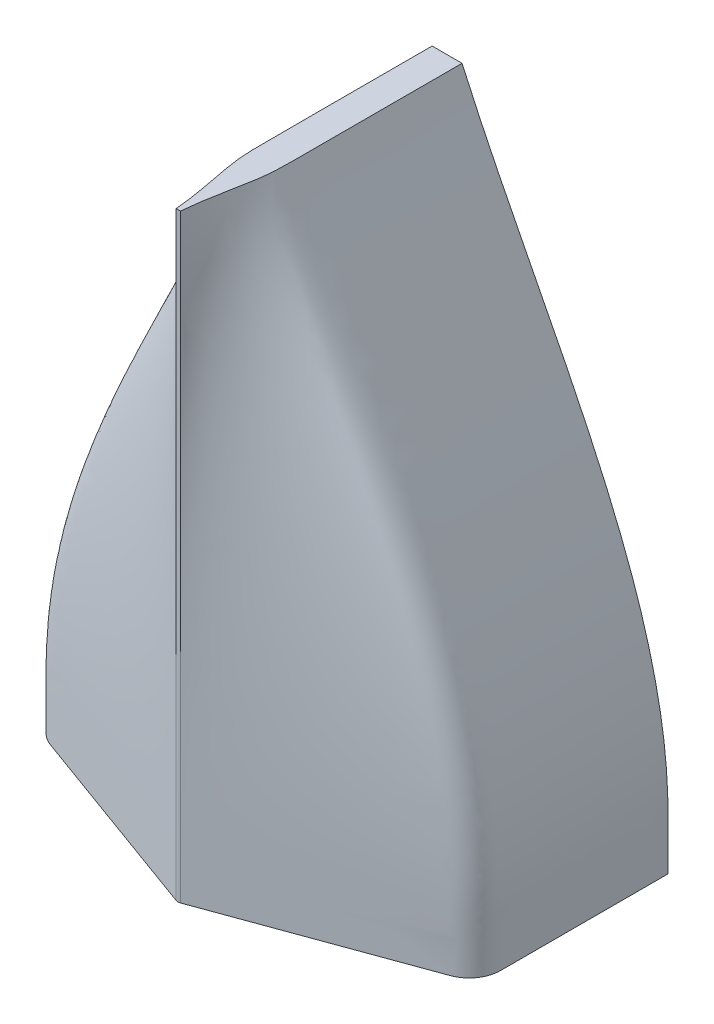
ISO-10303-21;
HEADER;
FILE_DESCRIPTION(('STEP AP214'),'2;1');
FILE_NAME('part.step','',(''),(''),'','','');
FILE_SCHEMA(('AUTOMOTIVE_DESIGN { 1 0 10303 214 1 1 1 1 }'));
ENDSEC;
DATA;
#1=APPLICATION_CONTEXT('core data for automotive mechanical design processes');
#2=APPLICATION_PROTOCOL_DEFINITION('international standard','automotive_design',2000,#1);
#3=PRODUCT_CONTEXT('',#1,'mechanical');
#4=PRODUCT('Part','Part','',(#3));
#5=PRODUCT_RELATED_PRODUCT_CATEGORY('part','',(#4));
#6=PRODUCT_DEFINITION_FORMATION('','',#4);
#7=PRODUCT_DEFINITION_CONTEXT('part definition',#1,'design');
#8=PRODUCT_DEFINITION('design','',#6,#7);
#9=PRODUCT_DEFINITION_SHAPE('','',#8);
#10=(LENGTH_UNIT() NAMED_UNIT(*) SI_UNIT(.MILLI.,.METRE.));
#11=(NAMED_UNIT(*) PLANE_ANGLE_UNIT() SI_UNIT($,.RADIAN.));
#12=(NAMED_UNIT(*) SI_UNIT($,.STERADIAN.) SOLID_ANGLE_UNIT());
#13=UNCERTAINTY_MEASURE_WITH_UNIT(LENGTH_MEASURE(1.E-05),#10,'distance_accuracy_value','');
#14=(GEOMETRIC_REPRESENTATION_CONTEXT(3) GLOBAL_UNCERTAINTY_ASSIGNED_CONTEXT((#13)) GLOBAL_UNIT_ASSIGNED_CONTEXT((#10,
#11,#12)) REPRESENTATION_CONTEXT('',''));
#15=CARTESIAN_POINT('',(0.,0.,0.));
#16=DIRECTION('',(0.,0.,1.));
#17=DIRECTION('',(1.,0.,0.));
#18=AXIS2_PLACEMENT_3D('',#15,#16,#17);
#19=CARTESIAN_POINT('',(69.3213828425096,0.,-0.817696380816725));
#20=DIRECTION('',(0.,-1.,0.));
#21=DIRECTION('',(0.,0.,-1.));
#22=AXIS2_PLACEMENT_3D('',#19,#20,#21);
#23=PLANE('',#22);
#24=DIRECTION('',(0.,0.,1.));
#25=VECTOR('',#24,1.);
#26=CARTESIAN_POINT('',(-60.6786171574904,0.,-0.81769638081678));
#27=LINE('',#26,#25);
#28=CARTESIAN_POINT('',(-60.6786171574904,0.,-53.8156209987196));
#29=VERTEX_POINT('',#28);
#30=CARTESIAN_POINT('',(-60.6786171574904,0.,-0.817696380816779));
#31=VERTEX_POINT('',#30);
#32=EDGE_CURVE('E348',#29,#31,#27,.T.);
#33=ORIENTED_EDGE('',*,*,#32,.F.);
#34=DIRECTION('',(-1.,0.,0.));
#35=VECTOR('',#34,1.);
#36=CARTESIAN_POINT('',(-60.6786171574904,0.,-53.8156209987196));
#37=LINE('',#36,#35);
#38=CARTESIAN_POINT('',(79.3213828425096,0.,-53.8156209987196));
#39=VERTEX_POINT('',#38);
#40=EDGE_CURVE('E418',#39,#29,#37,.T.);
#41=ORIENTED_EDGE('',*,*,#40,.F.);
#42=DIRECTION('',(0.,0.,-1.));
#43=VECTOR('',#42,1.);
#44=CARTESIAN_POINT('',(79.3213828425096,0.,-53.8156209987196));
#45=LINE('',#44,#43);
#46=CARTESIAN_POINT('',(79.3213828425096,0.,-0.817696380350896));
#47=VERTEX_POINT('',#46);
#48=EDGE_CURVE('E462',#47,#39,#45,.T.);
#49=ORIENTED_EDGE('',*,*,#48,.F.);
#50=CARTESIAN_POINT('',(69.3213828425096,0.,-0.817696380816725));
#51=DIRECTION('',(0.,1.,0.));
#52=DIRECTION('',(0.,0.,-1.));
#53=AXIS2_PLACEMENT_3D('',#50,#51,#52);
#54=CIRCLE('',#53,10.);
#55=CARTESIAN_POINT('',(72.7415842757666,0.,8.57922982704226));
#56=VERTEX_POINT('',#55);
#57=EDGE_CURVE('E469',#56,#47,#54,.T.);
#58=ORIENTED_EDGE('',*,*,#57,.F.);
#59=DIRECTION('',(0.939692620785911,0.,-0.342020143325663));
#60=VECTOR('',#59,1.);
#61=CARTESIAN_POINT('',(72.7415842757662,0.,8.5792298270424));
#62=LINE('',#61,#60);
#63=CARTESIAN_POINT('',(10.005423129161,0.,31.4133250965341));
#64=VERTEX_POINT('',#63);
#65=EDGE_CURVE('E480',#64,#56,#62,.T.);
#66=ORIENTED_EDGE('',*,*,#65,.F.);
#67=CARTESIAN_POINT('',(9.32138284250964,0.,29.5339398549623));
#68=DIRECTION('',(0.,1.,0.));
#69=DIRECTION('',(0.,0.,-1.));
#70=AXIS2_PLACEMENT_3D('',#67,#68,#69);
#71=CIRCLE('',#70,2.);
#72=CARTESIAN_POINT('',(8.6373425558583,0.,31.4133250965341));
#73=VERTEX_POINT('',#72);
#74=EDGE_CURVE('E343',#73,#64,#71,.T.);
#75=ORIENTED_EDGE('',*,*,#74,.F.);
#76=DIRECTION('',(0.939692620785911,0.,0.342020143325663));
#77=VECTOR('',#76,1.);
#78=CARTESIAN_POINT('',(8.6373425558583,0.,31.4133250965341));
#79=LINE('',#78,#77);
#80=CARTESIAN_POINT('',(-54.098818590747,0.,8.57922982704239));
#81=VERTEX_POINT('',#80);
#82=EDGE_CURVE('E509',#81,#73,#79,.T.);
#83=ORIENTED_EDGE('',*,*,#82,.F.);
#84=CARTESIAN_POINT('',(-50.6786171574904,0.,-0.817696380816728));
#85=DIRECTION('',(0.,1.,0.));
#86=DIRECTION('',(0.,0.,-1.));
#87=AXIS2_PLACEMENT_3D('',#84,#85,#86);
#88=CIRCLE('',#87,10.);
#89=EDGE_CURVE('E284',#31,#81,#88,.T.);
#90=ORIENTED_EDGE('',*,*,#89,.F.);
#91=EDGE_LOOP('',(#33,#41,#49,#58,#66,#75,#83,#90));
#92=FACE_BOUND('',#91,.T.);
#93=ADVANCED_FACE('F274',(#92),#23,.T.);
#94=CARTESIAN_POINT('',(8.82138284250962,200.,-53.8156209987196));
#95=DIRECTION('',(0.,0.,-1.));
#96=DIRECTION('',(1.,0.,0.));
#97=AXIS2_PLACEMENT_3D('',#94,#95,#96);
#98=PLANE('',#97);
#99=DIRECTION('',(-1.,0.,0.));
#100=VECTOR('',#99,1.);
#101=CARTESIAN_POINT('',(8.82138284250962,190.,-53.8156209987196));
#102=LINE('',#101,#100);
#103=CARTESIAN_POINT('',(14.0692876207852,190.,-53.8156209987196));
#104=VERTEX_POINT('',#103);
#105=CARTESIAN_POINT('',(4.57347806423401,190.,-53.8156209987196));
#106=VERTEX_POINT('',#105);
#107=EDGE_CURVE('E339',#104,#106,#102,.T.);
#108=ORIENTED_EDGE('',*,*,#107,.F.);
#109=CARTESIAN_POINT('',(9.82138284250962,200.,-53.8156209987196));
#110=CARTESIAN_POINT('',(34.0634562478761,140.393372464945,-53.8156209987196));
#111=CARTESIAN_POINT('',(80.362552085754,79.4719654991847,-53.8156209987195));
#112=CARTESIAN_POINT('',(79.2869193069982,9.99620187961251,-53.8156209987196));
#113=CARTESIAN_POINT('',(79.3213828425096,3.33333333333333,-53.8156209987196));
#114=CARTESIAN_POINT('',(79.3213828425096,0.,-53.8156209987196));
#115=B_SPLINE_CURVE_WITH_KNOTS('',3,(#109,#110,#111,#112,#113,#114),.UNSPECIFIED.,.F.,.F.,(4,1,
1,4),(0.,0.903879271275143,0.951939635637572,1.),.UNSPECIFIED.);
#116=EDGE_CURVE('E278',#104,#39,#115,.T.);
#117=ORIENTED_EDGE('',*,*,#116,.T.);
#118=ORIENTED_EDGE('',*,*,#40,.T.);
#119=CARTESIAN_POINT('',(8.82138284250962,200.,-53.8156209987196));
#120=CARTESIAN_POINT('',(-15.4206905628568,140.393372464945,-53.8156209987196));
#121=CARTESIAN_POINT('',(-61.7197864007349,79.4719654991847,-53.8156209987195));
#122=CARTESIAN_POINT('',(-60.6441536219789,9.99620187961251,-53.8156209987196));
#123=CARTESIAN_POINT('',(-60.6786171574904,3.33333333333333,-53.8156209987196));
#124=CARTESIAN_POINT('',(-60.6786171574904,0.,-53.8156209987196));
#125=B_SPLINE_CURVE_WITH_KNOTS('',3,(#119,#120,#121,#122,#123,#124),.UNSPECIFIED.,.F.,.F.,(4,1,
1,4),(0.,0.903879271275143,0.951939635637572,1.),.UNSPECIFIED.);
#126=EDGE_CURVE('E350',#29,#106,#125,.F.);
#127=ORIENTED_EDGE('',*,*,#126,.T.);
#128=EDGE_LOOP('',(#108,#117,#118,#127));
#129=FACE_BOUND('',#128,.T.);
#130=ADVANCED_FACE('F424',(#129),#98,.T.);
#131=CARTESIAN_POINT('',(9.82138284250962,200.,-53.8156209987196));
#132=CARTESIAN_POINT('',(34.0634562478761,140.393372464945,-53.8156209987196));
#133=CARTESIAN_POINT('',(80.362552085754,79.4719654991847,-53.8156209987195));
#134=CARTESIAN_POINT('',(79.2869193069982,9.99620187961251,-53.8156209987196));
#135=CARTESIAN_POINT('',(79.3213828425096,3.33333333333333,-53.8156209987196));
#136=CARTESIAN_POINT('',(79.3213828425096,0.,-53.8156209987196));
#137=CARTESIAN_POINT('',(9.82138284250962,200.,-50.482676560163));
#138=CARTESIAN_POINT('',(34.0622581634669,140.393685940455,-49.9923464884705));
#139=CARTESIAN_POINT('',(80.3625796479676,79.4719582876069,-48.5188687278219));
#140=CARTESIAN_POINT('',(79.2869183946668,9.99620211832151,-48.5531009509234));
#141=CARTESIAN_POINT('',(79.3213828425096,3.33333333333333,-48.55200414218));
#142=CARTESIAN_POINT('',(79.3213828425096,0.,-48.55200414218));
#143=CARTESIAN_POINT('',(9.82138284250962,200.,-43.1777571417248));
#144=CARTESIAN_POINT('',(34.0598619946487,140.394312891473,-41.7067669266471));
#145=CARTESIAN_POINT('',(80.3626347723949,79.4719438644514,-39.135492713872));
#146=CARTESIAN_POINT('',(79.2869165700042,9.99620259573951,-39.1952292330497));
#147=CARTESIAN_POINT('',(79.3213828425097,3.33333333333334,-39.1933152604648));
#148=CARTESIAN_POINT('',(79.3213828425097,0.,-39.1933152604648));
#149=CARTESIAN_POINT('',(9.82138284250962,200.,-29.7836860581526));
#150=CARTESIAN_POINT('',(34.0760346688234,140.394527772832,-28.5976716330076));
#151=CARTESIAN_POINT('',(80.3622627162224,79.4719389210551,-26.3043908397963));
#152=CARTESIAN_POINT('',(79.2869288853613,9.99620275936987,-26.3576689426929));
#153=CARTESIAN_POINT('',(79.3213828425096,3.33333333333333,-26.3559618993344));
#154=CARTESIAN_POINT('',(79.3213828425096,0.,-26.3559618993344));
#155=CARTESIAN_POINT('',(9.82138284250962,200.,-14.5809241513471));
#156=CARTESIAN_POINT('',(34.0152555740289,140.391860248948,-14.3801097762544));
#157=CARTESIAN_POINT('',(80.3636609535897,79.4720002880693,-13.8708825002475));
#158=CARTESIAN_POINT('',(79.2868826025851,9.99620072807257,-13.882713002334));
#159=CARTESIAN_POINT('',(79.3213828425096,3.33333333333333,-13.8823339501734));
#160=CARTESIAN_POINT('',(79.3213828425096,0.,-13.8823339501734));
#161=CARTESIAN_POINT('',(9.82138284250962,200.,-5.12492127300493));
#162=CARTESIAN_POINT('',(34.1674479525071,140.396379322998,-5.0864307385206));
#163=CARTESIAN_POINT('',(80.3601597321366,79.4718963257082,-5.32498140443458));
#164=CARTESIAN_POINT('',(79.2869984958182,9.99620416930996,-5.31943933258615));
#165=CARTESIAN_POINT('',(79.3213828425096,3.33333333333334,-5.31961690191438));
#166=CARTESIAN_POINT('',(79.3213828425096,0.,-5.31961690191438));
#167=CARTESIAN_POINT('',(9.82138284250962,200.,0.074649629141914));
#168=CARTESIAN_POINT('',(34.0419118463138,140.392749521437,0.0666753794124148));
#169=CARTESIAN_POINT('',(80.363047719778,79.4719798301466,0.116096925115402));
#170=CARTESIAN_POINT('',(79.2869029011152,9.99620140524619,0.114948750759664));
#171=CARTESIAN_POINT('',(79.3213828425096,3.33333333333333,0.114985538544923));
#172=CARTESIAN_POINT('',(79.3213828425096,0.,0.114985538544923));
#173=CARTESIAN_POINT('',(9.82138284250965,200.,2.07032083784979));
#174=CARTESIAN_POINT('',(33.9833638796793,140.391051554823,2.05006110407094));
#175=CARTESIAN_POINT('',(80.097903700917,79.4720188922679,1.98179279714276));
#176=CARTESIAN_POINT('',(79.0265585761082,9.99620011225871,1.98337882441507));
#177=CARTESIAN_POINT('',(79.0608847341457,3.33333333333333,1.98332800771601));
#178=CARTESIAN_POINT('',(79.0608847341457,0.,1.98332800771601));
#179=CARTESIAN_POINT('',(9.8213828425096,200.,4.85022373715482));
#180=CARTESIAN_POINT('',(33.5616332885196,140.378909988786,4.77473540721883));
#181=CARTESIAN_POINT('',(78.8930108862218,79.4722982118494,4.63712570105081));
#182=CARTESIAN_POINT('',(77.8398603922902,9.99619086655693,4.64032268595842));
#183=CARTESIAN_POINT('',(77.8736035899347,3.33333333333333,4.64022025378541));
#184=CARTESIAN_POINT('',(77.8736035899347,0.,4.64022025378541));
#185=CARTESIAN_POINT('',(9.82138284250963,200.,6.6083811124841));
#186=CARTESIAN_POINT('',(32.9808354071925,140.362406798836,6.59941989288879));
#187=CARTESIAN_POINT('',(77.1855583077032,79.4726778716149,6.58635309607367));
#188=CARTESIAN_POINT('',(76.1585825521916,9.99617829951475,6.586656667336));
#189=CARTESIAN_POINT('',(76.1914871048591,3.33333333333333,6.58664694083901));
#190=CARTESIAN_POINT('',(76.1914871048591,0.,6.58664694083901));
#191=CARTESIAN_POINT('',(9.82138284250962,200.,7.79612244759282));
#192=CARTESIAN_POINT('',(32.3632216015056,140.345165817862,7.82101843325157));
#193=CARTESIAN_POINT('',(75.3563930488216,79.4730745044362,7.8599775526634));
#194=CARTESIAN_POINT('',(74.3575643755073,9.99616517065082,7.8590724441486));
#195=CARTESIAN_POINT('',(74.3895670888241,3.33333333333333,7.85910144404527));
#196=CARTESIAN_POINT('',(74.3895670888241,0.,7.85910144404527));
#197=CARTESIAN_POINT('',(9.82138284250962,200.,8.32702778065809));
#198=CARTESIAN_POINT('',(31.9824590240575,140.334687906767,8.33468912144861));
#199=CARTESIAN_POINT('',(74.2733360882162,79.4733155512447,8.3686286337514));
#200=CARTESIAN_POINT('',(73.2908233028298,9.99615719180847,8.36784014206994));
#201=CARTESIAN_POINT('',(73.3223032511341,3.33333333333333,8.36786540553494));
#202=CARTESIAN_POINT('',(73.3223032511341,0.,8.36786540553494));
#203=CARTESIAN_POINT('',(9.83896553445853,200.,10.7607351396051));
#204=CARTESIAN_POINT('',(30.1324001579765,140.283754978419,10.6944884214369));
#205=CARTESIAN_POINT('',(68.5829719999392,79.4744872752377,10.4009549976643));
#206=CARTESIAN_POINT('',(67.6896781961046,9.99611840680622,10.4077744434128));
#207=CARTESIAN_POINT('',(67.7182995465679,3.33333333333333,10.4075559467145));
#208=CARTESIAN_POINT('',(67.7182995465679,0.,10.4075559467145));
#209=CARTESIAN_POINT('',(9.86831104105107,200.,14.4016667283226));
#210=CARTESIAN_POINT('',(26.3414765776926,140.186607783641,14.3463667761305));
#211=CARTESIAN_POINT('',(57.7430657141222,79.4767221692966,14.2940881479467));
#212=CARTESIAN_POINT('',(57.0135357315403,9.9960444300236,14.2953026987945));
#213=CARTESIAN_POINT('',(57.0369100493911,3.33333333333333,14.2952637842904));
#214=CARTESIAN_POINT('',(57.0369100493911,0.,14.2952637842904));
#215=CARTESIAN_POINT('',(9.90802822621158,200.,19.3294247007361));
#216=CARTESIAN_POINT('',(20.5039224252382,140.075160229472,19.7040588375884));
#217=CARTESIAN_POINT('',(40.5357240313382,79.4792860464862,20.4826724956339));
#218=CARTESIAN_POINT('',(40.0703399447784,9.99595956363601,20.4645835382272));
#219=CARTESIAN_POINT('',(40.0852509639574,3.33333333333334,20.4651631128165));
#220=CARTESIAN_POINT('',(40.0852509639574,0.,20.4651631128165));
#221=CARTESIAN_POINT('',(9.95061349002079,200.,24.6130285713264));
#222=CARTESIAN_POINT('',(14.8307555466657,140.009734278117,25.3291132058318));
#223=CARTESIAN_POINT('',(24.1589897059,79.4807911858812,26.3614133052045));
#224=CARTESIAN_POINT('',(23.9422737150583,9.995909742317,26.3374306376319));
#225=CARTESIAN_POINT('',(23.949217348047,3.33333333333333,26.3381990481265));
#226=CARTESIAN_POINT('',(23.949217348047,0.,26.3381990481265));
#227=CARTESIAN_POINT('',(9.98135343470422,200.,28.4269697374265));
#228=CARTESIAN_POINT('',(11.6080674535859,140.003244759372,28.665664615595));
#229=CARTESIAN_POINT('',(14.5024906840442,79.4809404787859,29.826317645691));
#230=CARTESIAN_POINT('',(14.4352466818465,9.99590480060234,29.7993530490539));
#231=CARTESIAN_POINT('',(14.4374011960111,3.33333333333333,29.80021700128));
#232=CARTESIAN_POINT('',(14.4374011960111,0.,29.80021700128));
#233=CARTESIAN_POINT('',(10.005423129161,200.,31.4133250965341));
#234=CARTESIAN_POINT('',(10.005423129161,140.,31.4133250965341));
#235=CARTESIAN_POINT('',(10.0054231291609,79.4810151252383,31.4133250965341));
#236=CARTESIAN_POINT('',(10.005423129161,9.99590232974501,31.4133250965341));
#237=CARTESIAN_POINT('',(10.005423129161,3.33333333333333,31.4133250965341));
#238=CARTESIAN_POINT('',(10.005423129161,0.,31.4133250965341));
#239=B_SPLINE_SURFACE_WITH_KNOTS('',3,3,((#131,#132,#133,#134,#135,#136),(#137,#138,#139,#140,
#141,#142),(#143,#144,#145,#146,#147,#148),(#149,#150,#151,#152,#153,#154),(#155,#156,#157,#158,
#159,#160),(#161,#162,#163,#164,#165,#166),(#167,#168,#169,#170,#171,#172),(#173,#174,#175,#176,
#177,#178),(#179,#180,#181,#182,#183,#184),(#185,#186,#187,#188,#189,#190),(#191,#192,#193,#194,
#195,#196),(#197,#198,#199,#200,#201,#202),(#203,#204,#205,#206,#207,#208),(#209,#210,#211,#212,
#213,#214),(#215,#216,#217,#218,#219,#220),(#221,#222,#223,#224,#225,#226),(#227,#228,#229,#230,
#231,#232),(#233,#234,#235,#236,#237,#238)),.UNSPECIFIED.,.F.,.F.,.F.,(4,1,1,1,2,1,1,1,1,2,1,1,
1,4),(4,1,1,4),(0.,0.118865670859502,0.237731341719005,0.356597012578507,0.475462683438009,
0.500088587533455,0.5247144916289,0.549340395724345,0.561653347772068,0.573966299819791,
0.680474724864843,0.786983149909895,0.893491574954948,1.),(0.,0.903879271275143,
0.951939635637572,1.),.UNSPECIFIED.);
#240=CARTESIAN_POINT('',(10.005423129161,190.,31.4133250965341));
#241=CARTESIAN_POINT('',(10.0418568858361,190.,30.9975093731855));
#242=CARTESIAN_POINT('',(10.0803577473287,190.,30.581861922396));
#243=CARTESIAN_POINT('',(10.1624101381668,190.,29.7514600602642));
#244=CARTESIAN_POINT('',(10.2059569138712,190.,29.3367051773534));
#245=CARTESIAN_POINT('',(10.2990498903314,190.,28.5081540371158));
#246=CARTESIAN_POINT('',(10.3485919167432,190.,28.0943573149115));
#247=CARTESIAN_POINT('',(10.454386525077,190.,27.2677744209949));
#248=CARTESIAN_POINT('',(10.5106366399034,190.,26.8549879343908));
#249=CARTESIAN_POINT('',(10.5997750662539,190.,26.2365117106941));
#250=CARTESIAN_POINT('',(10.6302810059505,190.,26.0304748784739));
#251=CARTESIAN_POINT('',(10.6926660106328,190.,25.6186086285125));
#252=CARTESIAN_POINT('',(10.7245450798746,190.,25.4127792114161));
#253=CARTESIAN_POINT('',(10.7893856382574,190.,25.001014499915));
#254=CARTESIAN_POINT('',(10.8223484948582,190.,24.7950794218599));
#255=CARTESIAN_POINT('',(10.8890181515602,190.,24.3833300659253));
#256=CARTESIAN_POINT('',(10.9227249509189,190.,24.1775157879255));
#257=CARTESIAN_POINT('',(10.9908951328117,190.,23.7659579447442));
#258=CARTESIAN_POINT('',(11.0253587084389,190.,23.5602144115394));
#259=CARTESIAN_POINT('',(11.0949883415856,190.,23.1488464584885));
#260=CARTESIAN_POINT('',(11.1301543988279,190.,22.9432220385953));
#261=CARTESIAN_POINT('',(11.23668324563,190.,22.3263767137973));
#262=CARTESIAN_POINT('',(11.3090525444789,190.,21.915329330081));
#263=CARTESIAN_POINT('',(11.4561973379716,190.,21.093480668225));
#264=CARTESIAN_POINT('',(11.5309738724015,190.,20.6826795766735));
#265=CARTESIAN_POINT('',(11.6826695399804,190.,19.861257855825));
#266=CARTESIAN_POINT('',(11.759589741852,190.,19.4506374240942));
#267=CARTESIAN_POINT('',(11.9530415264911,190.,18.4289913001586));
#268=CARTESIAN_POINT('',(12.0705505299982,190.,17.8181515002773));
#269=CARTESIAN_POINT('',(12.2470104768426,190.,16.9018664622033));
#270=CARTESIAN_POINT('',(12.3058692291447,190.,16.5964026509014));
#271=CARTESIAN_POINT('',(12.423243488717,190.,15.9854095846826));
#272=CARTESIAN_POINT('',(12.481758996873,190.,15.6798803299366));
#273=CARTESIAN_POINT('',(12.5980203486717,190.,15.0688091437178));
#274=CARTESIAN_POINT('',(12.6557665074151,190.,14.7632672722764));
#275=CARTESIAN_POINT('',(12.7701922657155,190.,14.1519802463159));
#276=CARTESIAN_POINT('',(12.8268718552349,190.,13.8462350899117));
#277=CARTESIAN_POINT('',(12.9383889764017,190.,13.2347104391324));
#278=CARTESIAN_POINT('',(12.9932282223222,190.,12.9289312588277));
#279=CARTESIAN_POINT('',(13.1004783774922,190.,12.3169553675821));
#280=CARTESIAN_POINT('',(13.1528893587018,190.,12.0107586692911));
#281=CARTESIAN_POINT('',(13.2547661706731,190.,11.3982864674946));
#282=CARTESIAN_POINT('',(13.3042357729505,190.,11.0920115937273));
#283=CARTESIAN_POINT('',(13.3760746374261,190.,10.6322186565595));
#284=CARTESIAN_POINT('',(13.3996275493832,190.,10.4788848650313));
#285=CARTESIAN_POINT('',(13.4459234307475,190.,10.1720960892732));
#286=CARTESIAN_POINT('',(13.4686664062795,190.,10.0186411059686));
#287=CARTESIAN_POINT('',(13.5132989503724,190.,9.71181896182743));
#288=CARTESIAN_POINT('',(13.535189631262,190.,9.55845196279478));
#289=CARTESIAN_POINT('',(13.5781379140995,190.,9.25159819987269));
#290=CARTESIAN_POINT('',(13.5991954991156,190.,9.0981114336137));
#291=CARTESIAN_POINT('',(13.640493925663,190.,8.79104625264623));
#292=CARTESIAN_POINT('',(13.6607348620596,190.,8.63746785069804));
#293=CARTESIAN_POINT('',(13.6904405080566,190.,8.40701776982521));
#294=CARTESIAN_POINT('',(13.7002329643027,190.,8.33018840727341));
#295=CARTESIAN_POINT('',(13.7193618592399,190.,8.1764731294969));
#296=CARTESIAN_POINT('',(13.7286983014517,190.,8.09958721471347));
#297=CARTESIAN_POINT('',(13.7467624849188,190.,7.94579044409891));
#298=CARTESIAN_POINT('',(13.7554905896708,190.,7.8688796312331));
#299=CARTESIAN_POINT('',(13.7722142868635,190.,7.71497827782385));
#300=CARTESIAN_POINT('',(13.7802098777484,190.,7.63798773711144));
#301=CARTESIAN_POINT('',(13.8032327136745,190.,7.40691808974164));
#302=CARTESIAN_POINT('',(13.8172957979004,190.,7.25274288101525));
#303=CARTESIAN_POINT('',(13.8434719128316,190.,6.94421990440132));
#304=CARTESIAN_POINT('',(13.8555848146928,190.,6.7898721257903));
#305=CARTESIAN_POINT('',(13.8781987651561,190.,6.48105904470327));
#306=CARTESIAN_POINT('',(13.8886998136274,190.,6.32659374221772));
#307=CARTESIAN_POINT('',(13.9082942695531,190.,6.01747429565262));
#308=CARTESIAN_POINT('',(13.9173867629833,190.,5.86282009404456));
#309=CARTESIAN_POINT('',(13.9343525762866,190.,5.5534459173822));
#310=CARTESIAN_POINT('',(13.9422259001238,190.,5.39872594254342));
#311=CARTESIAN_POINT('',(13.9642647199902,190.,4.93449771492153));
#312=CARTESIAN_POINT('',(13.9768494815838,190.,4.62491433456912));
#313=CARTESIAN_POINT('',(13.9989257861922,190.,4.00520335012767));
#314=CARTESIAN_POINT('',(14.0084129277178,190.,3.69507559575264));
#315=CARTESIAN_POINT('',(14.024911687343,190.,3.07475653961541));
#316=CARTESIAN_POINT('',(14.031923319743,190.,2.76456523823067));
#317=CARTESIAN_POINT('',(14.0437073841942,190.,2.14379889118605));
#318=CARTESIAN_POINT('',(14.0484773394013,190.,1.83322379943474));
#319=CARTESIAN_POINT('',(14.0562445936621,190.,1.21205165864302));
#320=CARTESIAN_POINT('',(14.0592418880726,190.,0.901454609547225));
#321=CARTESIAN_POINT('',(14.0664553320369,190.,-0.0306648313405029));
#322=CARTESIAN_POINT('',(14.0688881805571,190.,-0.652199538705247));
#323=CARTESIAN_POINT('',(14.0718395932471,190.,-1.58443946598823));
#324=CARTESIAN_POINT('',(14.0727070363245,190.,-1.89514512117239));
#325=CARTESIAN_POINT('',(14.0741827140232,190.,-2.51655723355313));
#326=CARTESIAN_POINT('',(14.0747909487101,190.,-2.8272636907495));
#327=CARTESIAN_POINT('',(14.0762926683625,190.,-3.75509821787286));
#328=CARTESIAN_POINT('',(14.0768758966359,190.,-4.37222671456641));
#329=CARTESIAN_POINT('',(14.0774273804327,190.,-5.60603207395503));
#330=CARTESIAN_POINT('',(14.0773960859314,190.,-6.22270893647983));
#331=CARTESIAN_POINT('',(14.0769199865491,190.,-7.45573160599003));
#332=CARTESIAN_POINT('',(14.0764754035251,190.,-8.07207741308746));
#333=CARTESIAN_POINT('',(14.0753473390287,190.,-9.30455857022309));
#334=CARTESIAN_POINT('',(14.0746639390899,190.,-9.92069392034238));
#335=CARTESIAN_POINT('',(14.0732186511757,190.,-11.1528747326969));
#336=CARTESIAN_POINT('',(14.0724567746527,190.,-11.7689201949467));
#337=CARTESIAN_POINT('',(14.0709968676156,190.,-13.0010417905108));
#338=CARTESIAN_POINT('',(14.0702988402735,190.,-13.6171179238292));
#339=CARTESIAN_POINT('',(14.069121628284,190.,-14.8503311297203));
#340=CARTESIAN_POINT('',(14.0686428224952,190.,-15.4674682026696));
#341=CARTESIAN_POINT('',(14.067900147603,190.,-16.701863068804));
#342=CARTESIAN_POINT('',(14.0676363205192,190.,-17.3191208620134));
#343=CARTESIAN_POINT('',(14.0672739805429,190.,-18.5537263813975));
#344=CARTESIAN_POINT('',(14.0671754917299,190.,-19.1710741075788));
#345=CARTESIAN_POINT('',(14.0671086789996,190.,-20.4058287127268));
#346=CARTESIAN_POINT('',(14.0671403675543,190.,-21.0232355916939));
#347=CARTESIAN_POINT('',(14.0672970478129,190.,-22.2580777201884));
#348=CARTESIAN_POINT('',(14.0674220438062,190.,-22.8755129697152));
#349=CARTESIAN_POINT('',(14.0677292299569,190.,-24.1103810576941));
#350=CARTESIAN_POINT('',(14.0679114198923,190.,-24.7278138961463));
#351=CARTESIAN_POINT('',(14.0683525474883,190.,-26.1368748654329));
#352=CARTESIAN_POINT('',(14.0686186361942,190.,-26.928502993865));
#353=CARTESIAN_POINT('',(14.0690982570207,190.,-28.5117138168839));
#354=CARTESIAN_POINT('',(14.069311792158,190.,-29.3032965114696));
#355=CARTESIAN_POINT('',(14.0696298625467,190.,-30.8864255659257));
#356=CARTESIAN_POINT('',(14.069734402804,190.,-31.6779719257951));
#357=CARTESIAN_POINT('',(14.0698640617606,190.,-33.2610373988012));
#358=CARTESIAN_POINT('',(14.0698891831942,190.,-34.0525565119379));
#359=CARTESIAN_POINT('',(14.069877694172,190.,-35.6355765853839));
#360=CARTESIAN_POINT('',(14.0698410851318,190.,-36.4270775456934));
#361=CARTESIAN_POINT('',(14.0697311376956,190.,-38.010070405754));
#362=CARTESIAN_POINT('',(14.0696577997197,190.,-38.8015623055053));
#363=CARTESIAN_POINT('',(14.0695010710912,190.,-40.3831439289347));
#364=CARTESIAN_POINT('',(14.0694176984775,190.,-41.1732336526147));
#365=CARTESIAN_POINT('',(14.0692784481812,190.,-42.7534221842864));
#366=CARTESIAN_POINT('',(14.0692225708147,190.,-43.5435209922781));
#367=CARTESIAN_POINT('',(14.0691439896,190.,-45.1237367419549));
#368=CARTESIAN_POINT('',(14.0691212865133,190.,-45.9138536836401));
#369=CARTESIAN_POINT('',(14.0691018465433,190.,-47.4941147503719));
#370=CARTESIAN_POINT('',(14.0691051105534,190.,-48.2842588754185));
#371=CARTESIAN_POINT('',(14.0691320961118,190.,-49.8645833586836));
#372=CARTESIAN_POINT('',(14.0691558185982,190.,-50.6547637169022));
#373=CARTESIAN_POINT('',(14.0692150490851,190.,-52.2351697163902));
#374=CARTESIAN_POINT('',(14.0692505577608,190.,-53.0253953576596));
#375=CARTESIAN_POINT('',(14.0692876207852,190.,-53.8156209987196));
#376=B_SPLINE_CURVE_WITH_KNOTS('',3,(#240,#241,#242,#243,#244,#245,#246,#247,#248,#249,#250,
#251,#252,#253,#254,#255,#256,#257,#258,#259,#260,#261,#262,#263,#264,#265,#266,#267,#268,#269,
#270,#271,#272,#273,#274,#275,#276,#277,#278,#279,#280,#281,#282,#283,#284,#285,#286,#287,#288,
#289,#290,#291,#292,#293,#294,#295,#296,#297,#298,#299,#300,#301,#302,#303,#304,#305,#306,#307,
#308,#309,#310,#311,#312,#313,#314,#315,#316,#317,#318,#319,#320,#321,#322,#323,#324,#325,#326,
#327,#328,#329,#330,#331,#332,#333,#334,#335,#336,#337,#338,#339,#340,#341,#342,#343,#344,#345,
#346,#347,#348,#349,#350,#351,#352,#353,#354,#355,#356,#357,#358,#359,#360,#361,#362,#363,#364,
#365,#366,#367,#368,#369,#370,#371,#372,#373,#374,#375),.UNSPECIFIED.,.F.,.F.,(4,2,2,2,2,2,2,2,
2,2,2,2,2,2,2,2,2,2,2,2,2,2,2,2,2,2,2,2,2,2,2,2,2,2,2,2,2,2,2,2,2,2,2,2,2,2,2,2,2,2,2,2,2,2,2,2,
2,2,2,2,2,2,2,2,2,2,2,4),(0.,1.25224068896315,2.5033111175699,3.75351541549371,5.00326132412164,
5.62810597841746,6.25295256956061,6.87862033565439,7.50428747735084,8.13011615828289,
8.75594459233923,10.0080441864788,11.2606920697688,12.5139760433443,14.3800915613445,
15.313340233619,16.2465864963954,17.1794379925291,18.1122982634197,19.0442639930178,
19.9762020867421,20.9069182425519,21.3723129497434,21.8377041368295,22.3024660595186,
22.7672374231354,23.2319546405773,23.4643067362211,23.6966570376729,23.9288672922379,
24.1610780399783,24.6255053431513,25.0899633173695,25.5544213292854,26.0191794810487,
26.4839361215836,27.4134288929827,28.3442367145979,29.2750391590711,30.206867649397,
31.138698580521,33.0033084548763,33.9354296012754,34.8675505111518,36.7189364780867,
38.5689668450868,40.4180046721039,42.2664118410711,44.1145496464314,45.9627792132957,
47.8141909437812,49.6659644637548,51.5180076488119,53.3702282780544,55.2225340602665,
57.0748326550932,59.4497171750319,61.8244653400339,64.1991044337724,66.5736617716717,
68.948164653471,71.3226403627189,73.6929095468891,76.0632059760731,78.433556801534,
80.8039891763524,83.1745302519508,85.545207177962),.UNSPECIFIED.);
#377=CARTESIAN_POINT('',(10.005423129161,190.,31.4133250965341));
#378=VERTEX_POINT('',#377);
#379=EDGE_CURVE('E328',#378,#104,#376,.T.);
#380=DIRECTION('',(0.,-1.,0.));
#381=VECTOR('',#380,1.);
#382=CARTESIAN_POINT('',(10.005423129161,101.469587420133,31.4133250965341));
#383=LINE('',#382,#381);
#384=EDGE_CURVE('E336',#378,#64,#383,.T.);
#385=ORIENTED_EDGE('',*,*,#379,.F.);
#386=ORIENTED_EDGE('',*,*,#384,.T.);
#387=ORIENTED_EDGE('',*,*,#65,.T.);
#388=ORIENTED_EDGE('',*,*,#57,.T.);
#389=ORIENTED_EDGE('',*,*,#48,.T.);
#390=ORIENTED_EDGE('',*,*,#116,.F.);
#391=EDGE_LOOP('',(#385,#386,#387,#388,#389,#390));
#392=FACE_BOUND('',#391,.T.);
#393=ADVANCED_FACE('F335',(#392),#239,.T.);
#394=CARTESIAN_POINT('',(8.6373425558583,200.,31.4133250965341));
#395=CARTESIAN_POINT('',(8.6373425558583,140.,31.4133250965341));
#396=CARTESIAN_POINT('',(8.63734255585828,79.4810151252383,31.4133250965341));
#397=CARTESIAN_POINT('',(8.6373425558583,9.99590232974501,31.4133250965341));
#398=CARTESIAN_POINT('',(8.6373425558583,3.33333333333333,31.4133250965341));
#399=CARTESIAN_POINT('',(8.6373425558583,0.,31.4133250965341));
#400=CARTESIAN_POINT('',(8.66141225031505,200.,28.4269697374265));
#401=CARTESIAN_POINT('',(7.0346982314334,140.003244759372,28.665664615595));
#402=CARTESIAN_POINT('',(4.14027500097503,79.4809404787859,29.826317645691));
#403=CARTESIAN_POINT('',(4.20751900317274,9.99590480060234,29.7993530490539));
#404=CARTESIAN_POINT('',(4.2053644890082,3.33333333333333,29.80021700128));
#405=CARTESIAN_POINT('',(4.2053644890082,0.,29.80021700128));
#406=CARTESIAN_POINT('',(8.69215219499848,200.,24.6130285713264));
#407=CARTESIAN_POINT('',(3.81201013835354,140.009734278117,25.3291132058318));
#408=CARTESIAN_POINT('',(-5.51622402088083,79.4807911858813,26.3614133052046));
#409=CARTESIAN_POINT('',(-5.29950803003907,9.99590974231701,26.3374306376319));
#410=CARTESIAN_POINT('',(-5.30645166302775,3.33333333333333,26.3381990481266));
#411=CARTESIAN_POINT('',(-5.30645166302775,0.,26.3381990481266));
#412=CARTESIAN_POINT('',(8.73473745880767,200.,19.3294247007362));
#413=CARTESIAN_POINT('',(-1.86115674021887,140.075160229473,19.7040588375884));
#414=CARTESIAN_POINT('',(-21.8929583463189,79.4792860464861,20.4826724956338));
#415=CARTESIAN_POINT('',(-21.4275742597591,9.995959563636,20.4645835382271));
#416=CARTESIAN_POINT('',(-21.4424852789381,3.33333333333333,20.4651631128164));
#417=CARTESIAN_POINT('',(-21.4424852789381,0.,20.4651631128164));
#418=CARTESIAN_POINT('',(8.77445464396818,200.,14.4016667283226));
#419=CARTESIAN_POINT('',(-7.69871089267341,140.186607783641,14.3463667761305));
#420=CARTESIAN_POINT('',(-39.1003000291031,79.4767221692968,14.2940881479468));
#421=CARTESIAN_POINT('',(-38.3707700465211,9.99604443002362,14.2953026987946));
#422=CARTESIAN_POINT('',(-38.3941443643719,3.33333333333334,14.2952637842904));
#423=CARTESIAN_POINT('',(-38.3941443643719,0.,14.2952637842904));
#424=CARTESIAN_POINT('',(8.80380015056072,200.,10.760735139605));
#425=CARTESIAN_POINT('',(-11.4896344729573,140.283754978418,10.6944884214369));
#426=CARTESIAN_POINT('',(-49.94020631492,79.4744872752377,10.4009549976643));
#427=CARTESIAN_POINT('',(-49.0469125110854,9.99611840680622,10.4077744434128));
#428=CARTESIAN_POINT('',(-49.0755338615487,3.33333333333333,10.4075559467145));
#429=CARTESIAN_POINT('',(-49.0755338615487,0.,10.4075559467145));
#430=CARTESIAN_POINT('',(8.82138284250962,200.,8.32702778065808));
#431=CARTESIAN_POINT('',(-13.3396933390383,140.334687906767,8.33468912144861));
#432=CARTESIAN_POINT('',(-55.6305704031969,79.4733155512447,8.36862863375139));
#433=CARTESIAN_POINT('',(-54.6480576178105,9.99615719180847,8.36784014206993));
#434=CARTESIAN_POINT('',(-54.6795375661148,3.33333333333333,8.36786540553494));
#435=CARTESIAN_POINT('',(-54.6795375661148,0.,8.36786540553494));
#436=CARTESIAN_POINT('',(8.82138284250962,200.,7.79612244759282));
#437=CARTESIAN_POINT('',(-13.7204559164863,140.345165817863,7.82101843325157));
#438=CARTESIAN_POINT('',(-56.7136273638026,79.4730745044361,7.8599775526634));
#439=CARTESIAN_POINT('',(-55.7147986904881,9.99616517065081,7.8590724441486));
#440=CARTESIAN_POINT('',(-55.7468014038049,3.33333333333333,7.85910144404527));
#441=CARTESIAN_POINT('',(-55.7468014038049,0.,7.85910144404527));
#442=CARTESIAN_POINT('',(8.82138284250962,200.,6.60838111248409));
#443=CARTESIAN_POINT('',(-14.3380697221732,140.362406798836,6.59941989288879));
#444=CARTESIAN_POINT('',(-58.5427926226838,79.4726778716149,6.58635309607366));
#445=CARTESIAN_POINT('',(-57.5158168671722,9.99617829951476,6.58665666733599));
#446=CARTESIAN_POINT('',(-57.5487214198397,3.33333333333334,6.586646940839));
#447=CARTESIAN_POINT('',(-57.5487214198397,0.,6.586646940839));
#448=CARTESIAN_POINT('',(8.82138284250962,200.,4.85022373715481));
#449=CARTESIAN_POINT('',(-14.9188676035003,140.378909988786,4.77473540721883));
#450=CARTESIAN_POINT('',(-60.2502452012027,79.4722982118493,4.63712570105081));
#451=CARTESIAN_POINT('',(-59.197094707271,9.99619086655692,4.64032268595842));
#452=CARTESIAN_POINT('',(-59.2308379049155,3.33333333333333,4.6402202537854));
#453=CARTESIAN_POINT('',(-59.2308379049156,0.,4.6402202537854));
#454=CARTESIAN_POINT('',(8.82138284250962,200.,2.07032083784979));
#455=CARTESIAN_POINT('',(-15.3405981946601,140.391051554822,2.05006110407094));
#456=CARTESIAN_POINT('',(-61.4551380158977,79.4720188922679,1.98179279714275));
#457=CARTESIAN_POINT('',(-60.3837928910889,9.99620011225872,1.98337882441506));
#458=CARTESIAN_POINT('',(-60.4181190491264,3.33333333333334,1.983328007716));
#459=CARTESIAN_POINT('',(-60.4181190491264,0.,1.983328007716));
#460=CARTESIAN_POINT('',(8.82138284250962,200.,0.0746496291419115));
#461=CARTESIAN_POINT('',(-15.3991461612946,140.392749521437,0.0666753794124094));
#462=CARTESIAN_POINT('',(-61.7202820347588,79.4719798301466,0.116096925115396));
#463=CARTESIAN_POINT('',(-60.6441372160959,9.99620140524619,0.114948750759658));
#464=CARTESIAN_POINT('',(-60.6786171574904,3.33333333333333,0.114985538544917));
#465=CARTESIAN_POINT('',(-60.6786171574904,0.,0.114985538544917));
#466=CARTESIAN_POINT('',(8.82138284250962,200.,-5.12492127300493));
#467=CARTESIAN_POINT('',(-15.5246822674879,140.396379322998,-5.0864307385206));
#468=CARTESIAN_POINT('',(-61.7173940471172,79.4718963257082,-5.32498140443455));
#469=CARTESIAN_POINT('',(-60.644232810799,9.99620416930996,-5.31943933258613));
#470=CARTESIAN_POINT('',(-60.6786171574904,3.33333333333333,-5.31961690191436));
#471=CARTESIAN_POINT('',(-60.6786171574904,0.,-5.31961690191436));
#472=CARTESIAN_POINT('',(8.82138284250961,200.,-14.580924151347));
#473=CARTESIAN_POINT('',(-15.3724898890097,140.391860248947,-14.3801097762544));
#474=CARTESIAN_POINT('',(-61.7208952685706,79.4720002880693,-13.8708825002474));
#475=CARTESIAN_POINT('',(-60.6441169175658,9.99620072807257,-13.8827130023339));
#476=CARTESIAN_POINT('',(-60.6786171574904,3.33333333333333,-13.8823339501733));
#477=CARTESIAN_POINT('',(-60.6786171574904,0.,-13.8823339501733));
#478=CARTESIAN_POINT('',(8.82138284250963,200.,-29.7836860581526));
#479=CARTESIAN_POINT('',(-15.4332689838042,140.394527772832,-28.5976716330076));
#480=CARTESIAN_POINT('',(-61.7194970312033,79.4719389210553,-26.3043908397964));
#481=CARTESIAN_POINT('',(-60.6441632003421,9.99620275936989,-26.357668942693));
#482=CARTESIAN_POINT('',(-60.6786171574904,3.33333333333334,-26.3559618993345));
#483=CARTESIAN_POINT('',(-60.6786171574904,0.,-26.3559618993345));
#484=CARTESIAN_POINT('',(8.82138284250962,200.,-43.1777571417248));
#485=CARTESIAN_POINT('',(-15.4170963096294,140.394312891473,-41.7067669266471));
#486=CARTESIAN_POINT('',(-61.7198690873754,79.4719438644512,-39.1354927138718));
#487=CARTESIAN_POINT('',(-60.6441508849849,9.9962025957395,-39.1952292330496));
#488=CARTESIAN_POINT('',(-60.6786171574904,3.33333333333333,-39.1933152604647));
#489=CARTESIAN_POINT('',(-60.6786171574904,0.,-39.1933152604647));
#490=CARTESIAN_POINT('',(8.82138284250962,200.,-50.482676560163));
#491=CARTESIAN_POINT('',(-15.4194924784477,140.393685940455,-49.9923464884705));
#492=CARTESIAN_POINT('',(-61.7198139629484,79.4719582876069,-48.5188687278219));
#493=CARTESIAN_POINT('',(-60.6441527096476,9.99620211832151,-48.5531009509234));
#494=CARTESIAN_POINT('',(-60.6786171574904,3.33333333333333,-48.55200414218));
#495=CARTESIAN_POINT('',(-60.6786171574904,0.,-48.55200414218));
#496=CARTESIAN_POINT('',(8.82138284250962,200.,-53.8156209987196));
#497=CARTESIAN_POINT('',(-15.4206905628568,140.393372464945,-53.8156209987196));
#498=CARTESIAN_POINT('',(-61.7197864007349,79.4719654991847,-53.8156209987194));
#499=CARTESIAN_POINT('',(-60.6441536219789,9.99620187961251,-53.8156209987196));
#500=CARTESIAN_POINT('',(-60.6786171574904,3.33333333333333,-53.8156209987196));
#501=CARTESIAN_POINT('',(-60.6786171574904,0.,-53.8156209987196));
#502=B_SPLINE_SURFACE_WITH_KNOTS('',3,3,((#394,#395,#396,#397,#398,#399),(#400,#401,#402,#403,
#404,#405),(#406,#407,#408,#409,#410,#411),(#412,#413,#414,#415,#416,#417),(#418,#419,#420,#421,
#422,#423),(#424,#425,#426,#427,#428,#429),(#430,#431,#432,#433,#434,#435),(#436,#437,#438,#439,
#440,#441),(#442,#443,#444,#445,#446,#447),(#448,#449,#450,#451,#452,#453),(#454,#455,#456,#457,
#458,#459),(#460,#461,#462,#463,#464,#465),(#466,#467,#468,#469,#470,#471),(#472,#473,#474,#475,
#476,#477),(#478,#479,#480,#481,#482,#483),(#484,#485,#486,#487,#488,#489),(#490,#491,#492,#493,
#494,#495),(#496,#497,#498,#499,#500,#501)),.UNSPECIFIED.,.F.,.F.,.F.,(4,1,1,1,2,1,1,1,1,2,1,1,
1,4),(4,1,1,4),(0.,0.106508425045052,0.213016850090105,0.319525275135157,0.426033700180209,
0.438346652227932,0.450659604275655,0.4752855083711,0.499911412466546,0.524537316561991,
0.643402987421493,0.762268658280995,0.881134329140498,1.),(0.,0.903879271275143,
0.951939635637572,1.),.UNSPECIFIED.);
#503=CARTESIAN_POINT('',(4.57347806423401,190.,-53.8156209987196));
#504=CARTESIAN_POINT('',(4.57350227855473,190.,-53.295854591563));
#505=CARTESIAN_POINT('',(4.57352598838848,190.,-52.7760881843636));
#506=CARTESIAN_POINT('',(4.57356968801397,190.,-51.7364606151975));
#507=CARTESIAN_POINT('',(4.57358967712674,190.,-51.2165994532308));
#508=CARTESIAN_POINT('',(4.57362321547144,190.,-50.1768139397385));
#509=CARTESIAN_POINT('',(4.5736367639203,190.,-49.6568895882129));
#510=CARTESIAN_POINT('',(4.57365522081788,190.,-48.617009260848));
#511=CARTESIAN_POINT('',(4.57366012874103,190.,-48.0970532850088));
#512=CARTESIAN_POINT('',(4.57365944189911,190.,-47.0564107376846));
#513=CARTESIAN_POINT('',(4.57365383236692,190.,-46.5357241661997));
#514=CARTESIAN_POINT('',(4.57363040042549,190.,-45.4943826812477));
#515=CARTESIAN_POINT('',(4.57361257875882,190.,-44.9737277677806));
#516=CARTESIAN_POINT('',(4.57356371609413,190.,-43.9324813160499));
#517=CARTESIAN_POINT('',(4.57353267670546,190.,-43.4118897777863));
#518=CARTESIAN_POINT('',(4.57345500351271,190.,-42.370801793878));
#519=CARTESIAN_POINT('',(4.57340837255815,190.,-41.8503053482331));
#520=CARTESIAN_POINT('',(4.57322614001925,190.,-39.940865925004));
#521=CARTESIAN_POINT('',(4.57307190626338,190.,-38.5519229493168));
#522=CARTESIAN_POINT('',(4.57287960281239,190.,-35.7744133411207));
#523=CARTESIAN_POINT('',(4.57284150165223,190.,-34.3858467086148));
#524=CARTESIAN_POINT('',(4.57301592849491,190.,-31.6085631375528));
#525=CARTESIAN_POINT('',(4.5732284836288,190.,-30.2198461989973));
#526=CARTESIAN_POINT('',(4.57394782317833,190.,-27.4417354171342));
#527=CARTESIAN_POINT('',(4.57445475097922,190.,-26.0523415738705));
#528=CARTESIAN_POINT('',(4.5752836122241,190.,-23.2723502366047));
#529=CARTESIAN_POINT('',(4.57560538503485,190.,-21.8817527425358));
#530=CARTESIAN_POINT('',(4.57564896280819,190.,-19.7949912873208));
#531=CARTESIAN_POINT('',(4.57559013528297,190.,-19.0988273391034));
#532=CARTESIAN_POINT('',(4.5752742406152,190.,-17.7064995402428));
#533=CARTESIAN_POINT('',(4.57501717348909,190.,-17.0103356895995));
#534=CARTESIAN_POINT('',(4.57423721727145,190.,-15.6196827013093));
#535=CARTESIAN_POINT('',(4.57371496908324,190.,-14.9251935633251));
#536=CARTESIAN_POINT('',(4.57239013414638,190.,-13.5362154013096));
#537=CARTESIAN_POINT('',(4.57158754733059,190.,-12.8417263772783));
#538=CARTESIAN_POINT('',(4.56992429714711,190.,-11.4525023000068));
#539=CARTESIAN_POINT('',(4.56906361329928,190.,-10.7577672467953));
#540=CARTESIAN_POINT('',(4.5674918810752,190.,-9.36829749846112));
#541=CARTESIAN_POINT('',(4.56678083258092,190.,-8.6735628033387));
#542=CARTESIAN_POINT('',(4.56574509604423,190.,-7.28460444794204));
#543=CARTESIAN_POINT('',(4.56542012400869,190.,-6.59038078790373));
#544=CARTESIAN_POINT('',(4.5654169888692,190.,-5.20193142630903));
#545=CARTESIAN_POINT('',(4.56573882754296,190.,-4.50770572475226));
#546=CARTESIAN_POINT('',(4.56693720604529,190.,-3.46700165303231));
#547=CARTESIAN_POINT('',(4.56745513530933,190.,-3.12052286463274));
#548=CARTESIAN_POINT('',(4.56876914860437,190.,-2.42756608490074));
#549=CARTESIAN_POINT('',(4.56956523238287,190.,-2.08108809356787));
#550=CARTESIAN_POINT('',(4.57101340872081,190.,-1.56137335844293));
#551=CARTESIAN_POINT('',(4.5715384731701,190.,-1.3881362259477));
#552=CARTESIAN_POINT('',(4.57266238944435,190.,-1.04166220949739));
#553=CARTESIAN_POINT('',(4.57326124121949,190.,-0.868425325542205));
#554=CARTESIAN_POINT('',(4.57529925326596,190.,-0.34871433992046));
#555=CARTESIAN_POINT('',(4.57697986650945,190.,-0.0022417216622323));
#556=CARTESIAN_POINT('',(4.58400803666815,190.,1.03512180268856));
#557=CARTESIAN_POINT('',(4.59134005612228,190.,1.72600860997444));
#558=CARTESIAN_POINT('',(4.6106967781917,190.,2.7622171131649));
#559=CARTESIAN_POINT('',(4.61854266738735,190.,3.10761496922691));
#560=CARTESIAN_POINT('',(4.63732459281261,190.,3.79834532993654));
#561=CARTESIAN_POINT('',(4.64826077403912,190.,4.14367783075671));
#562=CARTESIAN_POINT('',(4.66987714412231,190.,4.71872231330176));
#563=CARTESIAN_POINT('',(4.67941971327855,190.,4.94847660407533));
#564=CARTESIAN_POINT('',(4.70078268171394,190.,5.407873334994));
#565=CARTESIAN_POINT('',(4.71260300832786,190.,5.63751577847303));
#566=CARTESIAN_POINT('',(4.73906068800458,190.,6.09662592392865));
#567=CARTESIAN_POINT('',(4.75369784294332,190.,6.32609363705612));
#568=CARTESIAN_POINT('',(4.77827524469764,190.,6.67008561415076));
#569=CARTESIAN_POINT('',(4.78690373449484,190.,6.78470404730401));
#570=CARTESIAN_POINT('',(4.80513687176854,190.,7.01386420829132));
#571=CARTESIAN_POINT('',(4.81474152318737,190.,7.12840593581372));
#572=CARTESIAN_POINT('',(4.83511927930241,190.,7.35738632581632));
#573=CARTESIAN_POINT('',(4.84589238374994,190.,7.47182498831845));
#574=CARTESIAN_POINT('',(4.86892027925893,190.,7.70055196465739));
#575=CARTESIAN_POINT('',(4.88117504010686,190.,7.81484028151199));
#576=CARTESIAN_POINT('',(4.90720755036768,190.,8.04324828158735));
#577=CARTESIAN_POINT('',(4.92098538262274,190.,8.15736795529291));
#578=CARTESIAN_POINT('',(4.94946306496868,190.,8.38549300503315));
#579=CARTESIAN_POINT('',(4.9641629372486,190.,8.49949837825004));
#580=CARTESIAN_POINT('',(4.98938548732948,190.,8.69255697648709));
#581=CARTESIAN_POINT('',(4.99980893757439,190.,8.77162324074578));
#582=CARTESIAN_POINT('',(5.02088477063185,190.,8.92972440388554));
#583=CARTESIAN_POINT('',(5.03153715092089,190.,9.00875930310258));
#584=CARTESIAN_POINT('',(5.06382164634467,190.,9.24581754201113));
#585=CARTESIAN_POINT('',(5.08578137119276,190.,9.40379637725576));
#586=CARTESIAN_POINT('',(5.13058260862202,190.,9.71964901875259));
#587=CARTESIAN_POINT('',(5.15342423101818,190.,9.87752280941852));
#588=CARTESIAN_POINT('',(5.1999737896067,190.,10.193142353778));
#589=CARTESIAN_POINT('',(5.22368172445419,190.,10.3508881076698));
#590=CARTESIAN_POINT('',(5.27197474896852,190.,10.6664379116378));
#591=CARTESIAN_POINT('',(5.29656085152699,190.,10.8242418066769));
#592=CARTESIAN_POINT('',(5.34655430982243,190.,11.1397196103374));
#593=CARTESIAN_POINT('',(5.37196166718663,190.,11.2973935187007));
#594=CARTESIAN_POINT('',(5.44935819976839,190.,11.7702027331344));
#595=CARTESIAN_POINT('',(5.50252494290009,190.,12.0851457747179));
#596=CARTESIAN_POINT('',(5.61162578030144,190.,12.7149702828465));
#597=CARTESIAN_POINT('',(5.66756337117101,190.,13.029851140803));
#598=CARTESIAN_POINT('',(5.78150421417102,190.,13.6592454716035));
#599=CARTESIAN_POINT('',(5.83950751808497,190.,13.9737589350331));
#600=CARTESIAN_POINT('',(5.95680898779118,190.,14.6028875083731));
#601=CARTESIAN_POINT('',(6.01610845803835,190.,14.9175023740504));
#602=CARTESIAN_POINT('',(6.13554718630146,190.,15.5465695785155));
#603=CARTESIAN_POINT('',(6.1956864370577,190.,15.861021918684));
#604=CARTESIAN_POINT('',(6.37681595605902,190.,16.8046846012118));
#605=CARTESIAN_POINT('',(6.4984371978212,190.,17.4337735213573));
#606=CARTESIAN_POINT('',(6.67946615873772,190.,18.3777556259635));
#607=CARTESIAN_POINT('',(6.73958250795785,190.,18.6925125021305));
#608=CARTESIAN_POINT('',(6.85889077945477,190.,19.3222014960972));
#609=CARTESIAN_POINT('',(6.91808270254055,190.,19.6371336137432));
#610=CARTESIAN_POINT('',(7.03559697165069,190.,20.2689392602294));
#611=CARTESIAN_POINT('',(7.09391280606578,190.,20.585814001421));
#612=CARTESIAN_POINT('',(7.20921926328173,190.,21.2198045039473));
#613=CARTESIAN_POINT('',(7.26620988684589,190.,21.5369202651431));
#614=CARTESIAN_POINT('',(7.37869597210693,190.,22.1712854833324));
#615=CARTESIAN_POINT('',(7.4341920259989,190.,22.488534835239));
#616=CARTESIAN_POINT('',(7.54358216585538,190.,23.1233109014059));
#617=CARTESIAN_POINT('',(7.59747624715906,190.,23.4408376164703));
#618=CARTESIAN_POINT('',(7.70349315398172,190.,24.0760103160313));
#619=CARTESIAN_POINT('',(7.75561691956982,190.,24.3936561437187));
#620=CARTESIAN_POINT('',(7.85803113189687,190.,25.0292447560611));
#621=CARTESIAN_POINT('',(7.90832157924978,190.,25.3471875406167));
#622=CARTESIAN_POINT('',(8.00574662968058,190.,25.9833671034901));
#623=CARTESIAN_POINT('',(8.05288308776941,190.,26.3016035953878));
#624=CARTESIAN_POINT('',(8.14328427853454,190.,26.93862372119));
#625=CARTESIAN_POINT('',(8.18654905649489,190.,27.2574073486506));
#626=CARTESIAN_POINT('',(8.26907122914147,190.,27.8953858724457));
#627=CARTESIAN_POINT('',(8.30832994205093,190.,28.2145805982681));
#628=CARTESIAN_POINT('',(8.38310343206667,190.,28.8534122759129));
#629=CARTESIAN_POINT('',(8.41861812611258,190.,29.1730492373869));
#630=CARTESIAN_POINT('',(8.52017152736847,190.,30.1324105335828));
#631=CARTESIAN_POINT('',(8.58123020067412,190.,30.7726691766146));
#632=CARTESIAN_POINT('',(8.6373425558583,190.,31.4133250965341));
#633=B_SPLINE_CURVE_WITH_KNOTS('',3,(#503,#504,#505,#506,#507,#508,#509,#510,#511,#512,#513,
#514,#515,#516,#517,#518,#519,#520,#521,#522,#523,#524,#525,#526,#527,#528,#529,#530,#531,#532,
#533,#534,#535,#536,#537,#538,#539,#540,#541,#542,#543,#544,#545,#546,#547,#548,#549,#550,#551,
#552,#553,#554,#555,#556,#557,#558,#559,#560,#561,#562,#563,#564,#565,#566,#567,#568,#569,#570,
#571,#572,#573,#574,#575,#576,#577,#578,#579,#580,#581,#582,#583,#584,#585,#586,#587,#588,#589,
#590,#591,#592,#593,#594,#595,#596,#597,#598,#599,#600,#601,#602,#603,#604,#605,#606,#607,#608,
#609,#610,#611,#612,#613,#614,#615,#616,#617,#618,#619,#620,#621,#622,#623,#624,#625,#626,#627,
#628,#629,#630,#631,#632),.UNSPECIFIED.,.F.,.F.,(4,2,2,2,2,2,2,2,2,2,2,2,2,2,2,2,2,2,2,2,2,2,2,
2,2,2,2,2,2,2,2,2,2,2,2,2,2,2,2,2,2,2,2,2,2,2,2,2,2,2,2,2,2,2,2,2,2,2,2,2,2,2,2,2,4),(0.,
1.55929922319309,3.11888271022812,4.67865576527753,6.23852369277828,7.80058340719405,
9.36254814836778,10.9243227657022,12.4858121087736,16.6526410613132,20.8183409502775,
24.9844917762855,29.1526735865267,33.3244661175399,35.4129579477426,37.5014496047258,
39.5849175430635,41.6683859804364,43.7525927490073,45.8367978738056,47.9194689316831,
50.0021457136076,51.0415831678646,52.0810196785913,52.6007335105199,53.1204469913843,
54.1598794045898,56.2325935231971,57.2690424631271,58.3055400414532,58.9953883337594,
59.6852146221015,60.3749924086351,60.7198173068734,61.0646435977809,61.4094698152994,
61.7542890024024,62.0991269539843,62.4439732073371,62.6832241494253,62.9224724555867,
63.400963155347,63.8795136307633,64.3580633633086,64.8371841154478,65.3163058169616,
66.2744877731486,67.2339113190914,68.193358932909,69.1538211657816,70.1142751008189,
72.0364869415317,72.997825211554,73.9591626402299,74.9257484084877,75.8923336199879,
76.8585300308552,77.8247292525248,78.7904071177496,79.7560846595727,80.7211891554281,
81.6862823617254,82.6510569664037,83.6158529699302,85.5451913185523),.UNSPECIFIED.);
#634=CARTESIAN_POINT('',(8.6373425558583,190.,31.4133250965341));
#635=VERTEX_POINT('',#634);
#636=EDGE_CURVE('E290',#106,#635,#633,.T.);
#637=DIRECTION('',(0.,-1.,0.));
#638=VECTOR('',#637,1.);
#639=CARTESIAN_POINT('',(8.6373425558583,101.469587420133,31.4133250965341));
#640=LINE('',#639,#638);
#641=EDGE_CURVE('E346',#635,#73,#640,.T.);
#642=ORIENTED_EDGE('',*,*,#636,.F.);
#643=ORIENTED_EDGE('',*,*,#126,.F.);
#644=ORIENTED_EDGE('',*,*,#32,.T.);
#645=ORIENTED_EDGE('',*,*,#89,.T.);
#646=ORIENTED_EDGE('',*,*,#82,.T.);
#647=ORIENTED_EDGE('',*,*,#641,.F.);
#648=EDGE_LOOP('',(#642,#643,#644,#645,#646,#647));
#649=FACE_BOUND('',#648,.T.);
#650=ADVANCED_FACE('F374',(#649),#502,.T.);
#651=CARTESIAN_POINT('',(10.005423129161,200.,31.4133250965341));
#652=CARTESIAN_POINT('',(10.005423129161,140.,31.4133250965341));
#653=CARTESIAN_POINT('',(10.005423129161,79.4810151252383,31.4133250965341));
#654=CARTESIAN_POINT('',(10.005423129161,9.99590232974501,31.4133250965341));
#655=CARTESIAN_POINT('',(10.005423129161,3.33333333333333,31.4133250965341));
#656=CARTESIAN_POINT('',(10.005423129161,0.,31.4133250965341));
#657=CARTESIAN_POINT('',(9.54939627139341,200.,31.4133250965341));
#658=CARTESIAN_POINT('',(9.54939627139341,140.,31.4133250965341));
#659=CARTESIAN_POINT('',(9.56392096006703,79.4810151252383,31.5778371580296));
#660=CARTESIAN_POINT('',(9.5635835186774,9.99590232974501,31.5740151705233));
#661=CARTESIAN_POINT('',(9.56359433038149,3.33333333333333,31.5741376279314));
#662=CARTESIAN_POINT('',(9.56359433038149,0.,31.5741376279314));
#663=CARTESIAN_POINT('',(9.09336941362586,200.,31.4133250965341));
#664=CARTESIAN_POINT('',(9.09336941362586,140.,31.4133250965341));
#665=CARTESIAN_POINT('',(9.07884472495222,79.4810151252383,31.5778371580296));
#666=CARTESIAN_POINT('',(9.07918216634187,9.99590232974501,31.5740151705233));
#667=CARTESIAN_POINT('',(9.07917135463777,3.33333333333333,31.5741376279314));
#668=CARTESIAN_POINT('',(9.07917135463777,0.,31.5741376279314));
#669=CARTESIAN_POINT('',(8.6373425558583,200.,31.4133250965341));
#670=CARTESIAN_POINT('',(8.6373425558583,140.,31.4133250965341));
#671=CARTESIAN_POINT('',(8.63734255585828,79.4810151252383,31.4133250965341));
#672=CARTESIAN_POINT('',(8.6373425558583,9.99590232974501,31.4133250965341));
#673=CARTESIAN_POINT('',(8.6373425558583,3.33333333333333,31.4133250965341));
#674=CARTESIAN_POINT('',(8.6373425558583,0.,31.4133250965341));
#675=B_SPLINE_SURFACE_WITH_KNOTS('',3,3,((#651,#652,#653,#654,#655,#656),(#657,#658,#659,#660,
#661,#662),(#663,#664,#665,#666,#667,#668),(#669,#670,#671,#672,#673,#674)),.UNSPECIFIED.,.F.,
.F.,.F.,(4,4),(4,1,1,4),(0.,1.),(0.,0.903879271275143,0.951939635637572,1.),.UNSPECIFIED.);
#676=CARTESIAN_POINT('',(8.6373425558583,190.,31.4133250965341));
#677=CARTESIAN_POINT('',(8.75861110273031,190.,31.4136973480829));
#678=CARTESIAN_POINT('',(8.87987994527358,190.,31.4139705872328));
#679=CARTESIAN_POINT('',(9.12241791477274,190.,31.414319074897));
#680=CARTESIAN_POINT('',(9.24368704172863,190.,31.4143943234116));
#681=CARTESIAN_POINT('',(9.57844546174303,190.,31.4143288184886));
#682=CARTESIAN_POINT('',(9.79193473132923,190.,31.413980288371));
#683=CARTESIAN_POINT('',(10.005423129161,190.,31.4133250965341));
#684=B_SPLINE_CURVE_WITH_KNOTS('',3,(#676,#677,#678,#679,#680,#681,#682,#683),.UNSPECIFIED.,.F.,
.F.,(4,2,2,4),(0.,0.363807297721967,0.727614595212422,1.36808242020361),.UNSPECIFIED.);
#685=EDGE_CURVE('E12',#635,#378,#684,.T.);
#686=ORIENTED_EDGE('',*,*,#685,.F.);
#687=ORIENTED_EDGE('',*,*,#641,.T.);
#688=ORIENTED_EDGE('',*,*,#74,.T.);
#689=ORIENTED_EDGE('',*,*,#384,.F.);
#690=EDGE_LOOP('',(#686,#687,#688,#689));
#691=FACE_BOUND('',#690,.T.);
#692=ADVANCED_FACE('F341',(#691),#675,.T.);
#693=CARTESIAN_POINT('',(0.,190.,0.));
#694=DIRECTION('',(0.,-1.,0.));
#695=DIRECTION('',(0.,0.,-1.));
#696=AXIS2_PLACEMENT_3D('',#693,#694,#695);
#697=PLANE('',#696);
#698=ORIENTED_EDGE('',*,*,#107,.T.);
#699=ORIENTED_EDGE('',*,*,#636,.T.);
#700=ORIENTED_EDGE('',*,*,#685,.T.);
#701=ORIENTED_EDGE('',*,*,#379,.T.);
#702=EDGE_LOOP('',(#698,#699,#700,#701));
#703=FACE_BOUND('',#702,.T.);
#704=ADVANCED_FACE('F327',(#703),#697,.F.);
#705=CLOSED_SHELL('',(#93,#130,#393,#650,#692,#704));
#706=MANIFOLD_SOLID_BREP('B2',#705);
#707=ADVANCED_BREP_SHAPE_REPRESENTATION('',(#18,#706),#14);
#708=SHAPE_DEFINITION_REPRESENTATION(#9,#707);
ENDSEC;
END-ISO-10303-21;
